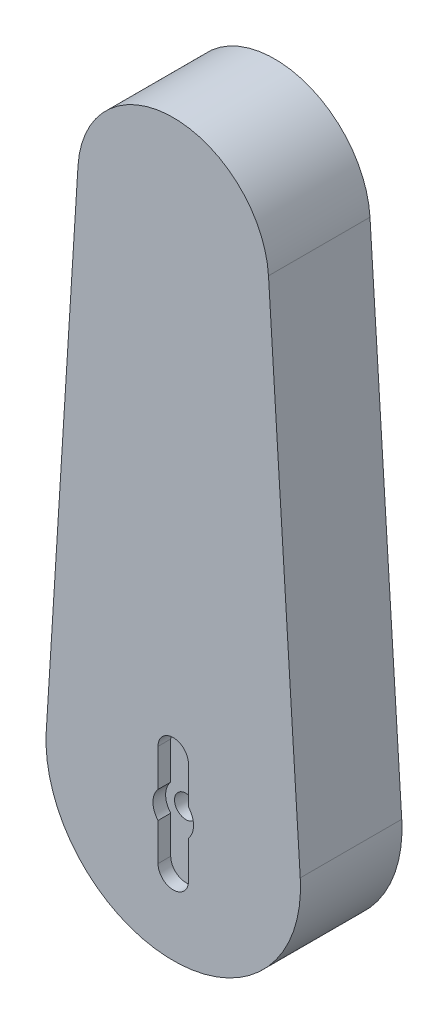
ISO-10303-21;
HEADER;
FILE_DESCRIPTION(('STEP AP214'),'2;1');
FILE_NAME('part.step','',(''),(''),'','','');
FILE_SCHEMA(('AUTOMOTIVE_DESIGN { 1 0 10303 214 1 1 1 1 }'));
ENDSEC;
DATA;
#1=APPLICATION_CONTEXT('core data for automotive mechanical design processes');
#2=APPLICATION_PROTOCOL_DEFINITION('international standard','automotive_design',2000,#1);
#3=PRODUCT_CONTEXT('',#1,'mechanical');
#4=PRODUCT('Part','Part','',(#3));
#5=PRODUCT_RELATED_PRODUCT_CATEGORY('part','',(#4));
#6=PRODUCT_DEFINITION_FORMATION('','',#4);
#7=PRODUCT_DEFINITION_CONTEXT('part definition',#1,'design');
#8=PRODUCT_DEFINITION('design','',#6,#7);
#9=PRODUCT_DEFINITION_SHAPE('','',#8);
#10=(LENGTH_UNIT() NAMED_UNIT(*) SI_UNIT(.MILLI.,.METRE.));
#11=(NAMED_UNIT(*) PLANE_ANGLE_UNIT() SI_UNIT($,.RADIAN.));
#12=(NAMED_UNIT(*) SI_UNIT($,.STERADIAN.) SOLID_ANGLE_UNIT());
#13=UNCERTAINTY_MEASURE_WITH_UNIT(LENGTH_MEASURE(1.E-05),#10,'distance_accuracy_value','');
#14=(GEOMETRIC_REPRESENTATION_CONTEXT(3) GLOBAL_UNCERTAINTY_ASSIGNED_CONTEXT((#13)) GLOBAL_UNIT_ASSIGNED_CONTEXT((#10,
#11,#12)) REPRESENTATION_CONTEXT('',''));
#15=CARTESIAN_POINT('',(0.,0.,0.));
#16=DIRECTION('',(0.,0.,1.));
#17=DIRECTION('',(1.,0.,0.));
#18=AXIS2_PLACEMENT_3D('',#15,#16,#17);
#19=CARTESIAN_POINT('',(0.,100.,20.));
#20=DIRECTION('',(0.,0.,-1.));
#21=DIRECTION('',(-1.,0.,0.));
#22=AXIS2_PLACEMENT_3D('',#19,#20,#21);
#23=CYLINDRICAL_SURFACE('',#22,18.8037490871857);
#24=CARTESIAN_POINT('',(0.,100.,0.));
#25=DIRECTION('',(0.,0.,1.));
#26=DIRECTION('',(1.,0.,0.));
#27=AXIS2_PLACEMENT_3D('',#24,#25,#26);
#28=CIRCLE('',#27,18.8037490871857);
#29=CARTESIAN_POINT('',(18.7667758039502,101.178603265779,0.));
#30=VERTEX_POINT('',#29);
#31=CARTESIAN_POINT('',(-18.7667758039502,101.178603265779,0.));
#32=VERTEX_POINT('',#31);
#33=EDGE_CURVE('E284',#30,#32,#28,.T.);
#34=ORIENTED_EDGE('',*,*,#33,.T.);
#35=DIRECTION('',(0.,0.,-1.));
#36=VECTOR('',#35,1.);
#37=CARTESIAN_POINT('',(-18.7667758039502,101.178603265779,20.));
#38=LINE('',#37,#36);
#39=CARTESIAN_POINT('',(-18.7667758039502,101.178603265779,20.));
#40=VERTEX_POINT('',#39);
#41=EDGE_CURVE('E11',#40,#32,#38,.T.);
#42=ORIENTED_EDGE('',*,*,#41,.F.);
#43=CARTESIAN_POINT('',(0.,100.,20.));
#44=DIRECTION('',(0.,0.,1.));
#45=DIRECTION('',(1.,0.,0.));
#46=AXIS2_PLACEMENT_3D('',#43,#44,#45);
#47=CIRCLE('',#46,18.8037490871857);
#48=CARTESIAN_POINT('',(18.7667758039502,101.178603265779,20.));
#49=VERTEX_POINT('',#48);
#50=EDGE_CURVE('E308',#49,#40,#47,.T.);
#51=ORIENTED_EDGE('',*,*,#50,.F.);
#52=DIRECTION('',(0.,0.,-1.));
#53=VECTOR('',#52,1.);
#54=CARTESIAN_POINT('',(18.7667758039502,101.178603265779,20.));
#55=LINE('',#54,#53);
#56=EDGE_CURVE('E319',#49,#30,#55,.T.);
#57=ORIENTED_EDGE('',*,*,#56,.T.);
#58=EDGE_LOOP('',(#34,#42,#51,#57));
#59=FACE_BOUND('',#58,.T.);
#60=ADVANCED_FACE('F42',(#59),#23,.T.);
#61=CARTESIAN_POINT('',(-18.7667758039502,101.178603265779,20.));
#62=DIRECTION('',(0.99803372811113,-0.0626791636239524,0.));
#63=DIRECTION('',(0.0626791636239524,0.99803372811113,0.));
#64=AXIS2_PLACEMENT_3D('',#61,#62,#63);
#65=PLANE('',#64);
#66=DIRECTION('',(-0.0626791636239524,-0.99803372811113,0.));
#67=VECTOR('',#66,1.);
#68=CARTESIAN_POINT('',(-18.7667758039502,101.178603265779,0.));
#69=LINE('',#68,#67);
#70=CARTESIAN_POINT('',(-25.0223677386003,1.57147102103928,0.));
#71=VERTEX_POINT('',#70);
#72=EDGE_CURVE('E322',#32,#71,#69,.T.);
#73=ORIENTED_EDGE('',*,*,#72,.T.);
#74=DIRECTION('',(0.,0.,-1.));
#75=VECTOR('',#74,1.);
#76=CARTESIAN_POINT('',(-25.0223677386003,1.57147102103928,20.));
#77=LINE('',#76,#75);
#78=CARTESIAN_POINT('',(-25.0223677386003,1.57147102103928,20.));
#79=VERTEX_POINT('',#78);
#80=EDGE_CURVE('E55',#79,#71,#77,.T.);
#81=ORIENTED_EDGE('',*,*,#80,.F.);
#82=DIRECTION('',(-0.0626791636239524,-0.99803372811113,0.));
#83=VECTOR('',#82,1.);
#84=CARTESIAN_POINT('',(-18.7667758039502,101.178603265779,20.));
#85=LINE('',#84,#83);
#86=EDGE_CURVE('E309',#40,#79,#85,.T.);
#87=ORIENTED_EDGE('',*,*,#86,.F.);
#88=ORIENTED_EDGE('',*,*,#41,.T.);
#89=EDGE_LOOP('',(#73,#81,#87,#88));
#90=FACE_BOUND('',#89,.T.);
#91=ADVANCED_FACE('F357',(#90),#65,.F.);
#92=CARTESIAN_POINT('',(0.,0.,20.));
#93=DIRECTION('',(0.,0.,-1.));
#94=DIRECTION('',(-1.,0.,0.));
#95=AXIS2_PLACEMENT_3D('',#92,#93,#94);
#96=CYLINDRICAL_SURFACE('',#95,25.071665449581);
#97=CARTESIAN_POINT('',(0.,0.,0.));
#98=DIRECTION('',(0.,0.,1.));
#99=DIRECTION('',(1.,0.,0.));
#100=AXIS2_PLACEMENT_3D('',#97,#98,#99);
#101=CIRCLE('',#100,25.071665449581);
#102=CARTESIAN_POINT('',(25.0223677386003,1.57147102103928,0.));
#103=VERTEX_POINT('',#102);
#104=EDGE_CURVE('E330',#71,#103,#101,.T.);
#105=ORIENTED_EDGE('',*,*,#104,.T.);
#106=DIRECTION('',(0.,0.,-1.));
#107=VECTOR('',#106,1.);
#108=CARTESIAN_POINT('',(25.0223677386003,1.57147102103928,20.));
#109=LINE('',#108,#107);
#110=CARTESIAN_POINT('',(25.0223677386003,1.57147102103928,20.));
#111=VERTEX_POINT('',#110);
#112=EDGE_CURVE('E333',#111,#103,#109,.T.);
#113=ORIENTED_EDGE('',*,*,#112,.F.);
#114=CARTESIAN_POINT('',(0.,0.,20.));
#115=DIRECTION('',(0.,0.,1.));
#116=DIRECTION('',(1.,0.,0.));
#117=AXIS2_PLACEMENT_3D('',#114,#115,#116);
#118=CIRCLE('',#117,25.071665449581);
#119=EDGE_CURVE('E314',#79,#111,#118,.T.);
#120=ORIENTED_EDGE('',*,*,#119,.F.);
#121=ORIENTED_EDGE('',*,*,#80,.T.);
#122=EDGE_LOOP('',(#105,#113,#120,#121));
#123=FACE_BOUND('',#122,.T.);
#124=ADVANCED_FACE('F343',(#123),#96,.T.);
#125=CARTESIAN_POINT('',(18.7667758039502,101.178603265779,20.));
#126=DIRECTION('',(-0.99803372811113,-0.0626791636239524,0.));
#127=DIRECTION('',(0.0626791636239524,-0.99803372811113,0.));
#128=AXIS2_PLACEMENT_3D('',#125,#126,#127);
#129=PLANE('',#128);
#130=DIRECTION('',(-0.0626791636239524,0.99803372811113,0.));
#131=VECTOR('',#130,1.);
#132=CARTESIAN_POINT('',(18.7667758039502,101.178603265779,0.));
#133=LINE('',#132,#131);
#134=EDGE_CURVE('E313',#103,#30,#133,.T.);
#135=ORIENTED_EDGE('',*,*,#134,.T.);
#136=ORIENTED_EDGE('',*,*,#56,.F.);
#137=DIRECTION('',(-0.0626791636239524,0.99803372811113,0.));
#138=VECTOR('',#137,1.);
#139=CARTESIAN_POINT('',(18.7667758039502,101.178603265779,20.));
#140=LINE('',#139,#138);
#141=EDGE_CURVE('E320',#111,#49,#140,.T.);
#142=ORIENTED_EDGE('',*,*,#141,.F.);
#143=ORIENTED_EDGE('',*,*,#112,.T.);
#144=EDGE_LOOP('',(#135,#136,#142,#143));
#145=FACE_BOUND('',#144,.T.);
#146=ADVANCED_FACE('F352',(#145),#129,.F.);
#147=CARTESIAN_POINT('',(0.,100.,20.));
#148=DIRECTION('',(0.,0.,1.));
#149=DIRECTION('',(1.,0.,0.));
#150=AXIS2_PLACEMENT_3D('',#147,#148,#149);
#151=PLANE('',#150);
#152=CARTESIAN_POINT('',(0.,-10.,20.));
#153=DIRECTION('',(0.,0.,1.));
#154=DIRECTION('',(1.,0.,0.));
#155=AXIS2_PLACEMENT_3D('',#152,#153,#154);
#156=CIRCLE('',#155,3.);
#157=CARTESIAN_POINT('',(-3.,-10.,20.));
#158=VERTEX_POINT('',#157);
#159=CARTESIAN_POINT('',(3.,-9.99999999999999,20.));
#160=VERTEX_POINT('',#159);
#161=EDGE_CURVE('E66',#158,#160,#156,.T.);
#162=ORIENTED_EDGE('',*,*,#161,.F.);
#163=DIRECTION('',(0.,-1.,0.));
#164=VECTOR('',#163,1.);
#165=CARTESIAN_POINT('',(-3.,-10.,20.));
#166=LINE('',#165,#164);
#167=CARTESIAN_POINT('',(-3.,-2.64575131106459,20.));
#168=VERTEX_POINT('',#167);
#169=EDGE_CURVE('E221',#168,#158,#166,.T.);
#170=ORIENTED_EDGE('',*,*,#169,.F.);
#171=CARTESIAN_POINT('',(0.,0.,20.));
#172=DIRECTION('',(0.,0.,1.));
#173=DIRECTION('',(1.,0.,0.));
#174=AXIS2_PLACEMENT_3D('',#171,#172,#173);
#175=CIRCLE('',#174,4.);
#176=CARTESIAN_POINT('',(-3.,2.64575131106459,20.));
#177=VERTEX_POINT('',#176);
#178=EDGE_CURVE('E274',#177,#168,#175,.T.);
#179=ORIENTED_EDGE('',*,*,#178,.F.);
#180=DIRECTION('',(0.,-1.,0.));
#181=VECTOR('',#180,1.);
#182=CARTESIAN_POINT('',(-3.,2.64575131106459,20.));
#183=LINE('',#182,#181);
#184=CARTESIAN_POINT('',(-3.,10.,20.));
#185=VERTEX_POINT('',#184);
#186=EDGE_CURVE('E271',#185,#177,#183,.T.);
#187=ORIENTED_EDGE('',*,*,#186,.F.);
#188=CARTESIAN_POINT('',(0.,10.,20.));
#189=DIRECTION('',(0.,0.,1.));
#190=DIRECTION('',(1.,0.,0.));
#191=AXIS2_PLACEMENT_3D('',#188,#189,#190);
#192=CIRCLE('',#191,3.);
#193=CARTESIAN_POINT('',(3.,10.,20.));
#194=VERTEX_POINT('',#193);
#195=EDGE_CURVE('E270',#194,#185,#192,.T.);
#196=ORIENTED_EDGE('',*,*,#195,.F.);
#197=DIRECTION('',(0.,1.,0.));
#198=VECTOR('',#197,1.);
#199=CARTESIAN_POINT('',(3.,2.64575131106459,20.));
#200=LINE('',#199,#198);
#201=CARTESIAN_POINT('',(3.,2.64575131106459,20.));
#202=VERTEX_POINT('',#201);
#203=EDGE_CURVE('E263',#202,#194,#200,.T.);
#204=ORIENTED_EDGE('',*,*,#203,.F.);
#205=CARTESIAN_POINT('',(0.,0.,20.));
#206=DIRECTION('',(0.,0.,1.));
#207=DIRECTION('',(1.,0.,0.));
#208=AXIS2_PLACEMENT_3D('',#205,#206,#207);
#209=CIRCLE('',#208,4.);
#210=CARTESIAN_POINT('',(3.,-2.64575131106459,20.));
#211=VERTEX_POINT('',#210);
#212=EDGE_CURVE('E259',#211,#202,#209,.T.);
#213=ORIENTED_EDGE('',*,*,#212,.F.);
#214=DIRECTION('',(0.,1.,0.));
#215=VECTOR('',#214,1.);
#216=CARTESIAN_POINT('',(3.,-10.,20.));
#217=LINE('',#216,#215);
#218=EDGE_CURVE('E254',#160,#211,#217,.T.);
#219=ORIENTED_EDGE('',*,*,#218,.F.);
#220=EDGE_LOOP('',(#162,#170,#179,#187,#196,#204,#213,#219));
#221=FACE_BOUND('',#220,.T.);
#222=ORIENTED_EDGE('',*,*,#50,.T.);
#223=ORIENTED_EDGE('',*,*,#86,.T.);
#224=ORIENTED_EDGE('',*,*,#119,.T.);
#225=ORIENTED_EDGE('',*,*,#141,.T.);
#226=EDGE_LOOP('',(#222,#223,#224,#225));
#227=FACE_BOUND('',#226,.T.);
#228=ADVANCED_FACE('F358',(#221,#227),#151,.T.);
#229=CARTESIAN_POINT('',(0.,100.,0.));
#230=DIRECTION('',(0.,0.,1.));
#231=DIRECTION('',(1.,0.,0.));
#232=AXIS2_PLACEMENT_3D('',#229,#230,#231);
#233=PLANE('',#232);
#234=CARTESIAN_POINT('',(0.,108.6,0.));
#235=DIRECTION('',(0.,0.,-1.));
#236=DIRECTION('',(-1.,0.,0.));
#237=AXIS2_PLACEMENT_3D('',#234,#235,#236);
#238=CIRCLE('',#237,1.);
#239=CARTESIAN_POINT('',(-1.,108.6,0.));
#240=VERTEX_POINT('',#239);
#241=EDGE_CURVE('E455',#240,#240,#238,.T.);
#242=ORIENTED_EDGE('',*,*,#241,.F.);
#243=EDGE_LOOP('',(#242));
#244=FACE_BOUND('',#243,.T.);
#245=CARTESIAN_POINT('',(0.,79.9,0.));
#246=DIRECTION('',(0.,0.,-1.));
#247=DIRECTION('',(-1.,0.,0.));
#248=AXIS2_PLACEMENT_3D('',#245,#246,#247);
#249=CIRCLE('',#248,1.);
#250=CARTESIAN_POINT('',(-1.,79.9,0.));
#251=VERTEX_POINT('',#250);
#252=EDGE_CURVE('E460',#251,#251,#249,.T.);
#253=ORIENTED_EDGE('',*,*,#252,.F.);
#254=EDGE_LOOP('',(#253));
#255=FACE_BOUND('',#254,.T.);
#256=DIRECTION('',(-1.,0.,0.));
#257=VECTOR('',#256,1.);
#258=CARTESIAN_POINT('',(6.4,82.5,0.));
#259=LINE('',#258,#257);
#260=CARTESIAN_POINT('',(6.4,82.5,0.));
#261=VERTEX_POINT('',#260);
#262=CARTESIAN_POINT('',(-6.4,82.5,0.));
#263=VERTEX_POINT('',#262);
#264=EDGE_CURVE('E198',#261,#263,#259,.T.);
#265=ORIENTED_EDGE('',*,*,#264,.F.);
#266=DIRECTION('',(0.,-1.,0.));
#267=VECTOR('',#266,1.);
#268=CARTESIAN_POINT('',(6.4,82.5,0.));
#269=LINE('',#268,#267);
#270=CARTESIAN_POINT('',(6.4,106.,0.));
#271=VERTEX_POINT('',#270);
#272=EDGE_CURVE('E56',#271,#261,#269,.T.);
#273=ORIENTED_EDGE('',*,*,#272,.F.);
#274=DIRECTION('',(1.,0.,0.));
#275=VECTOR('',#274,1.);
#276=CARTESIAN_POINT('',(6.4,106.,0.));
#277=LINE('',#276,#275);
#278=CARTESIAN_POINT('',(-6.4,106.,0.));
#279=VERTEX_POINT('',#278);
#280=EDGE_CURVE('E177',#279,#271,#277,.T.);
#281=ORIENTED_EDGE('',*,*,#280,.F.);
#282=DIRECTION('',(0.,1.,0.));
#283=VECTOR('',#282,1.);
#284=CARTESIAN_POINT('',(-6.4,82.5,0.));
#285=LINE('',#284,#283);
#286=EDGE_CURVE('E184',#263,#279,#285,.T.);
#287=ORIENTED_EDGE('',*,*,#286,.F.);
#288=EDGE_LOOP('',(#265,#273,#281,#287));
#289=FACE_BOUND('',#288,.T.);
#290=ORIENTED_EDGE('',*,*,#33,.F.);
#291=ORIENTED_EDGE('',*,*,#134,.F.);
#292=ORIENTED_EDGE('',*,*,#104,.F.);
#293=ORIENTED_EDGE('',*,*,#72,.F.);
#294=EDGE_LOOP('',(#290,#291,#292,#293));
#295=FACE_BOUND('',#294,.T.);
#296=ADVANCED_FACE('F348',(#244,#255,#289,#295),#233,.F.);
#297=CARTESIAN_POINT('',(0.,-10.,17.5));
#298=DIRECTION('',(0.,0.,1.));
#299=DIRECTION('',(1.,0.,0.));
#300=AXIS2_PLACEMENT_3D('',#297,#298,#299);
#301=CYLINDRICAL_SURFACE('',#300,3.);
#302=ORIENTED_EDGE('',*,*,#161,.T.);
#303=DIRECTION('',(0.,0.,1.));
#304=VECTOR('',#303,1.);
#305=CARTESIAN_POINT('',(3.,-10.,17.5));
#306=LINE('',#305,#304);
#307=CARTESIAN_POINT('',(3.,-10.,17.5));
#308=VERTEX_POINT('',#307);
#309=EDGE_CURVE('E252',#308,#160,#306,.T.);
#310=ORIENTED_EDGE('',*,*,#309,.F.);
#311=CARTESIAN_POINT('',(0.,-10.,17.5));
#312=DIRECTION('',(0.,0.,1.));
#313=DIRECTION('',(1.,0.,0.));
#314=AXIS2_PLACEMENT_3D('',#311,#312,#313);
#315=CIRCLE('',#314,3.);
#316=CARTESIAN_POINT('',(-3.,-10.,17.5));
#317=VERTEX_POINT('',#316);
#318=EDGE_CURVE('E218',#317,#308,#315,.T.);
#319=ORIENTED_EDGE('',*,*,#318,.F.);
#320=DIRECTION('',(0.,0.,1.));
#321=VECTOR('',#320,1.);
#322=CARTESIAN_POINT('',(-3.,-10.,17.5));
#323=LINE('',#322,#321);
#324=EDGE_CURVE('E285',#317,#158,#323,.T.);
#325=ORIENTED_EDGE('',*,*,#324,.T.);
#326=EDGE_LOOP('',(#302,#310,#319,#325));
#327=FACE_BOUND('',#326,.T.);
#328=ADVANCED_FACE('F375',(#327),#301,.F.);
#329=CARTESIAN_POINT('',(-3.,-10.,17.5));
#330=DIRECTION('',(-1.,0.,0.));
#331=DIRECTION('',(0.,-1.,0.));
#332=AXIS2_PLACEMENT_3D('',#329,#330,#331);
#333=PLANE('',#332);
#334=ORIENTED_EDGE('',*,*,#169,.T.);
#335=ORIENTED_EDGE('',*,*,#324,.F.);
#336=DIRECTION('',(0.,-1.,0.));
#337=VECTOR('',#336,1.);
#338=CARTESIAN_POINT('',(-3.,-10.,17.5));
#339=LINE('',#338,#337);
#340=CARTESIAN_POINT('',(-3.,-2.64575131106459,17.5));
#341=VERTEX_POINT('',#340);
#342=EDGE_CURVE('E250',#341,#317,#339,.T.);
#343=ORIENTED_EDGE('',*,*,#342,.F.);
#344=DIRECTION('',(0.,0.,1.));
#345=VECTOR('',#344,1.);
#346=CARTESIAN_POINT('',(-3.,-2.64575131106459,17.5));
#347=LINE('',#346,#345);
#348=EDGE_CURVE('E289',#341,#168,#347,.T.);
#349=ORIENTED_EDGE('',*,*,#348,.T.);
#350=EDGE_LOOP('',(#334,#335,#343,#349));
#351=FACE_BOUND('',#350,.T.);
#352=ADVANCED_FACE('F377',(#351),#333,.F.);
#353=CARTESIAN_POINT('',(0.,0.,17.5));
#354=DIRECTION('',(0.,0.,1.));
#355=DIRECTION('',(1.,0.,0.));
#356=AXIS2_PLACEMENT_3D('',#353,#354,#355);
#357=CYLINDRICAL_SURFACE('',#356,4.);
#358=ORIENTED_EDGE('',*,*,#178,.T.);
#359=ORIENTED_EDGE('',*,*,#348,.F.);
#360=CARTESIAN_POINT('',(0.,0.,17.5));
#361=DIRECTION('',(0.,0.,1.));
#362=DIRECTION('',(1.,0.,0.));
#363=AXIS2_PLACEMENT_3D('',#360,#361,#362);
#364=CIRCLE('',#363,4.);
#365=CARTESIAN_POINT('',(-3.,2.64575131106459,17.5));
#366=VERTEX_POINT('',#365);
#367=EDGE_CURVE('E243',#366,#341,#364,.T.);
#368=ORIENTED_EDGE('',*,*,#367,.F.);
#369=DIRECTION('',(0.,0.,1.));
#370=VECTOR('',#369,1.);
#371=CARTESIAN_POINT('',(-3.,2.64575131106459,17.5));
#372=LINE('',#371,#370);
#373=EDGE_CURVE('E288',#366,#177,#372,.T.);
#374=ORIENTED_EDGE('',*,*,#373,.T.);
#375=EDGE_LOOP('',(#358,#359,#368,#374));
#376=FACE_BOUND('',#375,.T.);
#377=ADVANCED_FACE('F397',(#376),#357,.F.);
#378=CARTESIAN_POINT('',(-3.,2.64575131106459,17.5));
#379=DIRECTION('',(-1.,0.,0.));
#380=DIRECTION('',(0.,-1.,0.));
#381=AXIS2_PLACEMENT_3D('',#378,#379,#380);
#382=PLANE('',#381);
#383=ORIENTED_EDGE('',*,*,#186,.T.);
#384=ORIENTED_EDGE('',*,*,#373,.F.);
#385=DIRECTION('',(0.,-1.,0.));
#386=VECTOR('',#385,1.);
#387=CARTESIAN_POINT('',(-3.,2.64575131106459,17.5));
#388=LINE('',#387,#386);
#389=CARTESIAN_POINT('',(-3.,10.,17.5));
#390=VERTEX_POINT('',#389);
#391=EDGE_CURVE('E238',#390,#366,#388,.T.);
#392=ORIENTED_EDGE('',*,*,#391,.F.);
#393=DIRECTION('',(0.,0.,1.));
#394=VECTOR('',#393,1.);
#395=CARTESIAN_POINT('',(-3.,10.,17.5));
#396=LINE('',#395,#394);
#397=EDGE_CURVE('E295',#390,#185,#396,.T.);
#398=ORIENTED_EDGE('',*,*,#397,.T.);
#399=EDGE_LOOP('',(#383,#384,#392,#398));
#400=FACE_BOUND('',#399,.T.);
#401=ADVANCED_FACE('F399',(#400),#382,.F.);
#402=CARTESIAN_POINT('',(0.,10.,17.5));
#403=DIRECTION('',(0.,0.,1.));
#404=DIRECTION('',(1.,0.,0.));
#405=AXIS2_PLACEMENT_3D('',#402,#403,#404);
#406=CYLINDRICAL_SURFACE('',#405,3.);
#407=ORIENTED_EDGE('',*,*,#195,.T.);
#408=ORIENTED_EDGE('',*,*,#397,.F.);
#409=CARTESIAN_POINT('',(0.,10.,17.5));
#410=DIRECTION('',(0.,0.,1.));
#411=DIRECTION('',(1.,0.,0.));
#412=AXIS2_PLACEMENT_3D('',#409,#410,#411);
#413=CIRCLE('',#412,3.);
#414=CARTESIAN_POINT('',(3.,10.,17.5));
#415=VERTEX_POINT('',#414);
#416=EDGE_CURVE('E237',#415,#390,#413,.T.);
#417=ORIENTED_EDGE('',*,*,#416,.F.);
#418=DIRECTION('',(0.,0.,1.));
#419=VECTOR('',#418,1.);
#420=CARTESIAN_POINT('',(3.,10.,17.5));
#421=LINE('',#420,#419);
#422=EDGE_CURVE('E293',#415,#194,#421,.T.);
#423=ORIENTED_EDGE('',*,*,#422,.T.);
#424=EDGE_LOOP('',(#407,#408,#417,#423));
#425=FACE_BOUND('',#424,.T.);
#426=ADVANCED_FACE('F395',(#425),#406,.F.);
#427=CARTESIAN_POINT('',(3.,2.64575131106459,17.5));
#428=DIRECTION('',(1.,0.,0.));
#429=DIRECTION('',(0.,1.,0.));
#430=AXIS2_PLACEMENT_3D('',#427,#428,#429);
#431=PLANE('',#430);
#432=ORIENTED_EDGE('',*,*,#203,.T.);
#433=ORIENTED_EDGE('',*,*,#422,.F.);
#434=DIRECTION('',(0.,1.,0.));
#435=VECTOR('',#434,1.);
#436=CARTESIAN_POINT('',(3.,2.64575131106459,17.5));
#437=LINE('',#436,#435);
#438=CARTESIAN_POINT('',(3.,2.64575131106459,17.5));
#439=VERTEX_POINT('',#438);
#440=EDGE_CURVE('E231',#439,#415,#437,.T.);
#441=ORIENTED_EDGE('',*,*,#440,.F.);
#442=DIRECTION('',(0.,0.,1.));
#443=VECTOR('',#442,1.);
#444=CARTESIAN_POINT('',(3.,2.64575131106459,17.5));
#445=LINE('',#444,#443);
#446=EDGE_CURVE('E297',#439,#202,#445,.T.);
#447=ORIENTED_EDGE('',*,*,#446,.T.);
#448=EDGE_LOOP('',(#432,#433,#441,#447));
#449=FACE_BOUND('',#448,.T.);
#450=ADVANCED_FACE('F389',(#449),#431,.F.);
#451=CARTESIAN_POINT('',(0.,0.,17.5));
#452=DIRECTION('',(0.,0.,1.));
#453=DIRECTION('',(1.,0.,0.));
#454=AXIS2_PLACEMENT_3D('',#451,#452,#453);
#455=CYLINDRICAL_SURFACE('',#454,4.);
#456=ORIENTED_EDGE('',*,*,#212,.T.);
#457=ORIENTED_EDGE('',*,*,#446,.F.);
#458=CARTESIAN_POINT('',(0.,0.,17.5));
#459=DIRECTION('',(0.,0.,1.));
#460=DIRECTION('',(1.,0.,0.));
#461=AXIS2_PLACEMENT_3D('',#458,#459,#460);
#462=CIRCLE('',#461,4.);
#463=CARTESIAN_POINT('',(3.,-2.64575131106459,17.5));
#464=VERTEX_POINT('',#463);
#465=EDGE_CURVE('E227',#464,#439,#462,.T.);
#466=ORIENTED_EDGE('',*,*,#465,.F.);
#467=DIRECTION('',(0.,0.,1.));
#468=VECTOR('',#467,1.);
#469=CARTESIAN_POINT('',(3.,-2.64575131106459,17.5));
#470=LINE('',#469,#468);
#471=EDGE_CURVE('E304',#464,#211,#470,.T.);
#472=ORIENTED_EDGE('',*,*,#471,.T.);
#473=EDGE_LOOP('',(#456,#457,#466,#472));
#474=FACE_BOUND('',#473,.T.);
#475=ADVANCED_FACE('F383',(#474),#455,.F.);
#476=CARTESIAN_POINT('',(3.,-10.,17.5));
#477=DIRECTION('',(1.,0.,0.));
#478=DIRECTION('',(0.,1.,0.));
#479=AXIS2_PLACEMENT_3D('',#476,#477,#478);
#480=PLANE('',#479);
#481=ORIENTED_EDGE('',*,*,#218,.T.);
#482=ORIENTED_EDGE('',*,*,#471,.F.);
#483=DIRECTION('',(0.,1.,0.));
#484=VECTOR('',#483,1.);
#485=CARTESIAN_POINT('',(3.,-10.,17.5));
#486=LINE('',#485,#484);
#487=EDGE_CURVE('E224',#308,#464,#486,.T.);
#488=ORIENTED_EDGE('',*,*,#487,.F.);
#489=ORIENTED_EDGE('',*,*,#309,.T.);
#490=EDGE_LOOP('',(#481,#482,#488,#489));
#491=FACE_BOUND('',#490,.T.);
#492=ADVANCED_FACE('F379',(#491),#480,.F.);
#493=CARTESIAN_POINT('',(0.,-10.,17.5));
#494=DIRECTION('',(0.,0.,1.));
#495=DIRECTION('',(1.,0.,0.));
#496=AXIS2_PLACEMENT_3D('',#493,#494,#495);
#497=PLANE('',#496);
#498=CARTESIAN_POINT('',(0.,0.,17.5));
#499=DIRECTION('',(0.,0.,1.));
#500=DIRECTION('',(1.,0.,0.));
#501=AXIS2_PLACEMENT_3D('',#498,#499,#500);
#502=CIRCLE('',#501,2.25);
#503=CARTESIAN_POINT('',(2.25,0.,17.5));
#504=VERTEX_POINT('',#503);
#505=EDGE_CURVE('E206',#504,#504,#502,.T.);
#506=ORIENTED_EDGE('',*,*,#505,.F.);
#507=EDGE_LOOP('',(#506));
#508=FACE_BOUND('',#507,.T.);
#509=ORIENTED_EDGE('',*,*,#318,.T.);
#510=ORIENTED_EDGE('',*,*,#487,.T.);
#511=ORIENTED_EDGE('',*,*,#465,.T.);
#512=ORIENTED_EDGE('',*,*,#440,.T.);
#513=ORIENTED_EDGE('',*,*,#416,.T.);
#514=ORIENTED_EDGE('',*,*,#391,.T.);
#515=ORIENTED_EDGE('',*,*,#367,.T.);
#516=ORIENTED_EDGE('',*,*,#342,.T.);
#517=EDGE_LOOP('',(#509,#510,#511,#512,#513,#514,#515,#516));
#518=FACE_BOUND('',#517,.T.);
#519=ADVANCED_FACE('F382',(#508,#518),#497,.T.);
#520=CARTESIAN_POINT('',(0.,0.,7.5));
#521=DIRECTION('',(0.,0.,1.));
#522=DIRECTION('',(1.,0.,0.));
#523=AXIS2_PLACEMENT_3D('',#520,#521,#522);
#524=CYLINDRICAL_SURFACE('',#523,2.25);
#525=CARTESIAN_POINT('',(0.,0.,7.5));
#526=DIRECTION('',(0.,0.,1.));
#527=DIRECTION('',(1.,0.,0.));
#528=AXIS2_PLACEMENT_3D('',#525,#526,#527);
#529=CIRCLE('',#528,2.25);
#530=CARTESIAN_POINT('',(2.25,0.,7.5));
#531=VERTEX_POINT('',#530);
#532=EDGE_CURVE('E215',#531,#531,#529,.T.);
#533=ORIENTED_EDGE('',*,*,#532,.F.);
#534=EDGE_LOOP('',(#533));
#535=FACE_BOUND('',#534,.T.);
#536=ORIENTED_EDGE('',*,*,#505,.T.);
#537=EDGE_LOOP('',(#536));
#538=FACE_BOUND('',#537,.T.);
#539=ADVANCED_FACE('F409',(#535,#538),#524,.F.);
#540=CARTESIAN_POINT('',(0.,0.,7.5));
#541=DIRECTION('',(0.,0.,1.));
#542=DIRECTION('',(1.,0.,0.));
#543=AXIS2_PLACEMENT_3D('',#540,#541,#542);
#544=PLANE('',#543);
#545=ORIENTED_EDGE('',*,*,#532,.T.);
#546=EDGE_LOOP('',(#545));
#547=FACE_BOUND('',#546,.T.);
#548=ADVANCED_FACE('F413',(#547),#544,.T.);
#549=CARTESIAN_POINT('',(6.4,82.5,16.));
#550=DIRECTION('',(1.,0.,0.));
#551=DIRECTION('',(0.,0.,-1.));
#552=AXIS2_PLACEMENT_3D('',#549,#550,#551);
#553=PLANE('',#552);
#554=ORIENTED_EDGE('',*,*,#272,.T.);
#555=DIRECTION('',(0.,0.,-1.));
#556=VECTOR('',#555,1.);
#557=CARTESIAN_POINT('',(6.4,82.5,16.));
#558=LINE('',#557,#556);
#559=CARTESIAN_POINT('',(6.4,82.5,16.));
#560=VERTEX_POINT('',#559);
#561=EDGE_CURVE('E154',#560,#261,#558,.T.);
#562=ORIENTED_EDGE('',*,*,#561,.F.);
#563=DIRECTION('',(0.,-1.,0.));
#564=VECTOR('',#563,1.);
#565=CARTESIAN_POINT('',(6.4,82.5,16.));
#566=LINE('',#565,#564);
#567=CARTESIAN_POINT('',(6.4,106.,16.));
#568=VERTEX_POINT('',#567);
#569=EDGE_CURVE('E157',#568,#560,#566,.T.);
#570=ORIENTED_EDGE('',*,*,#569,.F.);
#571=DIRECTION('',(0.,0.,-1.));
#572=VECTOR('',#571,1.);
#573=CARTESIAN_POINT('',(6.4,106.,16.));
#574=LINE('',#573,#572);
#575=EDGE_CURVE('E201',#568,#271,#574,.T.);
#576=ORIENTED_EDGE('',*,*,#575,.T.);
#577=EDGE_LOOP('',(#554,#562,#570,#576));
#578=FACE_BOUND('',#577,.T.);
#579=ADVANCED_FACE('F160',(#578),#553,.F.);
#580=CARTESIAN_POINT('',(6.4,106.,16.));
#581=DIRECTION('',(0.,1.,0.));
#582=DIRECTION('',(0.,0.,1.));
#583=AXIS2_PLACEMENT_3D('',#580,#581,#582);
#584=PLANE('',#583);
#585=ORIENTED_EDGE('',*,*,#280,.T.);
#586=ORIENTED_EDGE('',*,*,#575,.F.);
#587=DIRECTION('',(1.,0.,0.));
#588=VECTOR('',#587,1.);
#589=CARTESIAN_POINT('',(6.4,106.,16.));
#590=LINE('',#589,#588);
#591=CARTESIAN_POINT('',(-6.4,106.,16.));
#592=VERTEX_POINT('',#591);
#593=EDGE_CURVE('E167',#592,#568,#590,.T.);
#594=ORIENTED_EDGE('',*,*,#593,.F.);
#595=DIRECTION('',(0.,0.,-1.));
#596=VECTOR('',#595,1.);
#597=CARTESIAN_POINT('',(-6.4,106.,16.));
#598=LINE('',#597,#596);
#599=EDGE_CURVE('E210',#592,#279,#598,.T.);
#600=ORIENTED_EDGE('',*,*,#599,.T.);
#601=EDGE_LOOP('',(#585,#586,#594,#600));
#602=FACE_BOUND('',#601,.T.);
#603=ADVANCED_FACE('F423',(#602),#584,.F.);
#604=CARTESIAN_POINT('',(-6.4,82.5,16.));
#605=DIRECTION('',(-1.,0.,0.));
#606=DIRECTION('',(0.,0.,1.));
#607=AXIS2_PLACEMENT_3D('',#604,#605,#606);
#608=PLANE('',#607);
#609=ORIENTED_EDGE('',*,*,#286,.T.);
#610=ORIENTED_EDGE('',*,*,#599,.F.);
#611=DIRECTION('',(0.,1.,0.));
#612=VECTOR('',#611,1.);
#613=CARTESIAN_POINT('',(-6.4,82.5,16.));
#614=LINE('',#613,#612);
#615=CARTESIAN_POINT('',(-6.4,82.5,16.));
#616=VERTEX_POINT('',#615);
#617=EDGE_CURVE('E174',#616,#592,#614,.T.);
#618=ORIENTED_EDGE('',*,*,#617,.F.);
#619=DIRECTION('',(0.,0.,-1.));
#620=VECTOR('',#619,1.);
#621=CARTESIAN_POINT('',(-6.4,82.5,16.));
#622=LINE('',#621,#620);
#623=EDGE_CURVE('E164',#616,#263,#622,.T.);
#624=ORIENTED_EDGE('',*,*,#623,.T.);
#625=EDGE_LOOP('',(#609,#610,#618,#624));
#626=FACE_BOUND('',#625,.T.);
#627=ADVANCED_FACE('F424',(#626),#608,.F.);
#628=CARTESIAN_POINT('',(6.4,82.5,16.));
#629=DIRECTION('',(0.,-1.,0.));
#630=DIRECTION('',(0.,0.,-1.));
#631=AXIS2_PLACEMENT_3D('',#628,#629,#630);
#632=PLANE('',#631);
#633=ORIENTED_EDGE('',*,*,#264,.T.);
#634=ORIENTED_EDGE('',*,*,#623,.F.);
#635=DIRECTION('',(-1.,0.,0.));
#636=VECTOR('',#635,1.);
#637=CARTESIAN_POINT('',(6.4,82.5,16.));
#638=LINE('',#637,#636);
#639=EDGE_CURVE('E166',#560,#616,#638,.T.);
#640=ORIENTED_EDGE('',*,*,#639,.F.);
#641=ORIENTED_EDGE('',*,*,#561,.T.);
#642=EDGE_LOOP('',(#633,#634,#640,#641));
#643=FACE_BOUND('',#642,.T.);
#644=ADVANCED_FACE('F168',(#643),#632,.F.);
#645=CARTESIAN_POINT('',(0.,0.,16.));
#646=DIRECTION('',(0.,0.,1.));
#647=DIRECTION('',(1.,0.,0.));
#648=AXIS2_PLACEMENT_3D('',#645,#646,#647);
#649=PLANE('',#648);
#650=ORIENTED_EDGE('',*,*,#569,.T.);
#651=ORIENTED_EDGE('',*,*,#639,.T.);
#652=ORIENTED_EDGE('',*,*,#617,.T.);
#653=ORIENTED_EDGE('',*,*,#593,.T.);
#654=EDGE_LOOP('',(#650,#651,#652,#653));
#655=FACE_BOUND('',#654,.T.);
#656=ADVANCED_FACE('F176',(#655),#649,.F.);
#657=CARTESIAN_POINT('',(0.,79.9,6.));
#658=DIRECTION('',(0.,0.,-1.));
#659=DIRECTION('',(-1.,0.,0.));
#660=AXIS2_PLACEMENT_3D('',#657,#658,#659);
#661=CYLINDRICAL_SURFACE('',#660,1.);
#662=CARTESIAN_POINT('',(0.,79.9,6.));
#663=DIRECTION('',(0.,0.,-1.));
#664=DIRECTION('',(-1.,0.,0.));
#665=AXIS2_PLACEMENT_3D('',#662,#663,#664);
#666=CIRCLE('',#665,1.);
#667=CARTESIAN_POINT('',(-1.,79.9,6.));
#668=VERTEX_POINT('',#667);
#669=EDGE_CURVE('E190',#668,#668,#666,.T.);
#670=ORIENTED_EDGE('',*,*,#669,.F.);
#671=EDGE_LOOP('',(#670));
#672=FACE_BOUND('',#671,.T.);
#673=ORIENTED_EDGE('',*,*,#252,.T.);
#674=EDGE_LOOP('',(#673));
#675=FACE_BOUND('',#674,.T.);
#676=ADVANCED_FACE('F433',(#672,#675),#661,.F.);
#677=CARTESIAN_POINT('',(0.,79.9,6.));
#678=DIRECTION('',(0.,0.,-1.));
#679=DIRECTION('',(-1.,0.,0.));
#680=AXIS2_PLACEMENT_3D('',#677,#678,#679);
#681=PLANE('',#680);
#682=ORIENTED_EDGE('',*,*,#669,.T.);
#683=EDGE_LOOP('',(#682));
#684=FACE_BOUND('',#683,.T.);
#685=ADVANCED_FACE('F432',(#684),#681,.T.);
#686=CARTESIAN_POINT('',(0.,108.6,6.));
#687=DIRECTION('',(0.,0.,-1.));
#688=DIRECTION('',(-1.,0.,0.));
#689=AXIS2_PLACEMENT_3D('',#686,#687,#688);
#690=CYLINDRICAL_SURFACE('',#689,1.);
#691=CARTESIAN_POINT('',(0.,108.6,6.));
#692=DIRECTION('',(0.,0.,-1.));
#693=DIRECTION('',(-1.,0.,0.));
#694=AXIS2_PLACEMENT_3D('',#691,#692,#693);
#695=CIRCLE('',#694,1.);
#696=CARTESIAN_POINT('',(-1.,108.6,6.));
#697=VERTEX_POINT('',#696);
#698=EDGE_CURVE('E197',#697,#697,#695,.T.);
#699=ORIENTED_EDGE('',*,*,#698,.F.);
#700=EDGE_LOOP('',(#699));
#701=FACE_BOUND('',#700,.T.);
#702=ORIENTED_EDGE('',*,*,#241,.T.);
#703=EDGE_LOOP('',(#702));
#704=FACE_BOUND('',#703,.T.);
#705=ADVANCED_FACE('F440',(#701,#704),#690,.F.);
#706=CARTESIAN_POINT('',(0.,108.6,6.));
#707=DIRECTION('',(0.,0.,-1.));
#708=DIRECTION('',(-1.,0.,0.));
#709=AXIS2_PLACEMENT_3D('',#706,#707,#708);
#710=PLANE('',#709);
#711=ORIENTED_EDGE('',*,*,#698,.T.);
#712=EDGE_LOOP('',(#711));
#713=FACE_BOUND('',#712,.T.);
#714=ADVANCED_FACE('F441',(#713),#710,.T.);
#715=CLOSED_SHELL('',(#60,#91,#124,#146,#228,#296,#328,#352,#377,#401,#426,#450,#475,#492,#519,
#539,#548,#579,#603,#627,#644,#656,#676,#685,#705,#714));
#716=MANIFOLD_SOLID_BREP('B2',#715);
#717=ADVANCED_BREP_SHAPE_REPRESENTATION('',(#18,#716),#14);
#718=SHAPE_DEFINITION_REPRESENTATION(#9,#717);
ENDSEC;
END-ISO-10303-21;
